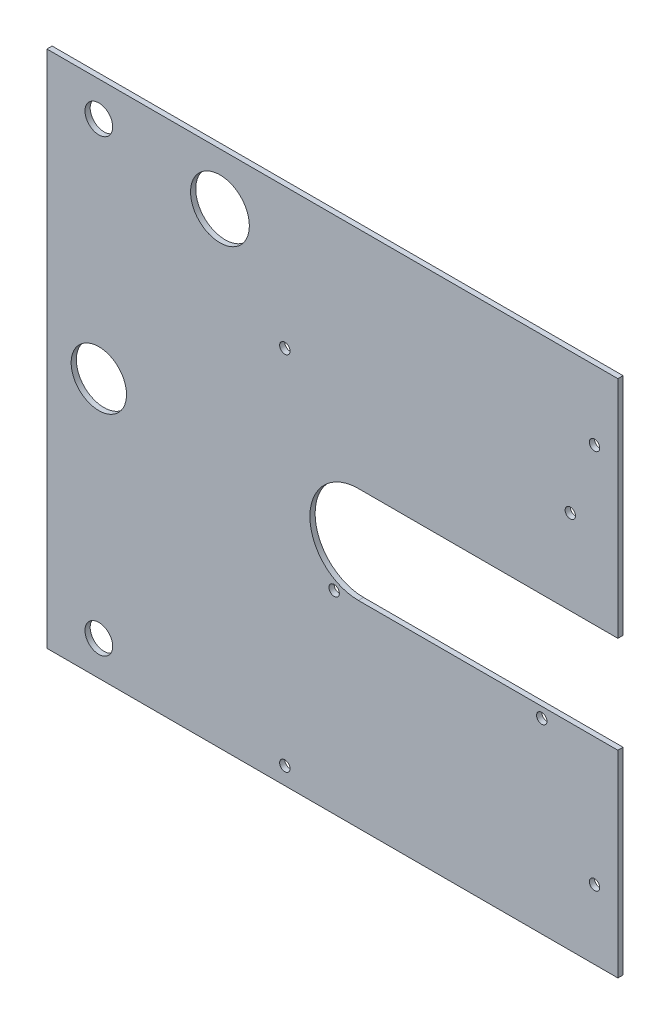
ISO-10303-21;
HEADER;
FILE_DESCRIPTION(('STEP AP214'),'2;1');
FILE_NAME('part.step','',(''),(''),'','','');
FILE_SCHEMA(('AUTOMOTIVE_DESIGN { 1 0 10303 214 1 1 1 1 }'));
ENDSEC;
DATA;
#1=APPLICATION_CONTEXT('core data for automotive mechanical design processes');
#2=APPLICATION_PROTOCOL_DEFINITION('international standard','automotive_design',2000,#1);
#3=PRODUCT_CONTEXT('',#1,'mechanical');
#4=PRODUCT('Part','Part','',(#3));
#5=PRODUCT_RELATED_PRODUCT_CATEGORY('part','',(#4));
#6=PRODUCT_DEFINITION_FORMATION('','',#4);
#7=PRODUCT_DEFINITION_CONTEXT('part definition',#1,'design');
#8=PRODUCT_DEFINITION('design','',#6,#7);
#9=PRODUCT_DEFINITION_SHAPE('','',#8);
#10=(LENGTH_UNIT() NAMED_UNIT(*) SI_UNIT(.MILLI.,.METRE.));
#11=(NAMED_UNIT(*) PLANE_ANGLE_UNIT() SI_UNIT($,.RADIAN.));
#12=(NAMED_UNIT(*) SI_UNIT($,.STERADIAN.) SOLID_ANGLE_UNIT());
#13=UNCERTAINTY_MEASURE_WITH_UNIT(LENGTH_MEASURE(1.E-05),#10,'distance_accuracy_value','');
#14=(GEOMETRIC_REPRESENTATION_CONTEXT(3) GLOBAL_UNCERTAINTY_ASSIGNED_CONTEXT((#13)) GLOBAL_UNIT_ASSIGNED_CONTEXT((#10,
#11,#12)) REPRESENTATION_CONTEXT('',''));
#15=CARTESIAN_POINT('',(0.,0.,0.));
#16=DIRECTION('',(0.,0.,1.));
#17=DIRECTION('',(1.,0.,0.));
#18=AXIS2_PLACEMENT_3D('',#15,#16,#17);
#19=CARTESIAN_POINT('',(165.,75.,1.5));
#20=DIRECTION('',(-1.,0.,0.));
#21=DIRECTION('',(0.,0.,1.));
#22=AXIS2_PLACEMENT_3D('',#19,#20,#21);
#23=PLANE('',#22);
#24=DIRECTION('',(0.,1.,0.));
#25=VECTOR('',#24,1.);
#26=CARTESIAN_POINT('',(165.,75.,1.5));
#27=LINE('',#26,#25);
#28=CARTESIAN_POINT('',(165.,9.99999999999999,1.5));
#29=VERTEX_POINT('',#28);
#30=CARTESIAN_POINT('',(165.,75.,1.5));
#31=VERTEX_POINT('',#30);
#32=EDGE_CURVE('E180',#29,#31,#27,.T.);
#33=ORIENTED_EDGE('',*,*,#32,.F.);
#34=DIRECTION('',(0.,0.,1.));
#35=VECTOR('',#34,1.);
#36=CARTESIAN_POINT('',(165.,9.99999999999999,0.));
#37=LINE('',#36,#35);
#38=CARTESIAN_POINT('',(165.,9.99999999999999,0.));
#39=VERTEX_POINT('',#38);
#40=EDGE_CURVE('E144',#39,#29,#37,.T.);
#41=ORIENTED_EDGE('',*,*,#40,.F.);
#42=DIRECTION('',(0.,1.,0.));
#43=VECTOR('',#42,1.);
#44=CARTESIAN_POINT('',(165.,75.,0.));
#45=LINE('',#44,#43);
#46=CARTESIAN_POINT('',(165.,75.,0.));
#47=VERTEX_POINT('',#46);
#48=EDGE_CURVE('E190',#39,#47,#45,.T.);
#49=ORIENTED_EDGE('',*,*,#48,.T.);
#50=DIRECTION('',(0.,0.,-1.));
#51=VECTOR('',#50,1.);
#52=CARTESIAN_POINT('',(165.,75.,1.5));
#53=LINE('',#52,#51);
#54=EDGE_CURVE('E195',#31,#47,#53,.T.);
#55=ORIENTED_EDGE('',*,*,#54,.F.);
#56=EDGE_LOOP('',(#33,#41,#49,#55));
#57=FACE_BOUND('',#56,.T.);
#58=ADVANCED_FACE('F35',(#57),#23,.F.);
#59=CARTESIAN_POINT('',(0.,75.,1.5));
#60=DIRECTION('',(1.,0.,0.));
#61=DIRECTION('',(0.,0.,-1.));
#62=AXIS2_PLACEMENT_3D('',#59,#60,#61);
#63=PLANE('',#62);
#64=DIRECTION('',(0.,-1.,0.));
#65=VECTOR('',#64,1.);
#66=CARTESIAN_POINT('',(0.,75.,0.));
#67=LINE('',#66,#65);
#68=CARTESIAN_POINT('',(0.,75.,0.));
#69=VERTEX_POINT('',#68);
#70=CARTESIAN_POINT('',(0.,-75.,0.));
#71=VERTEX_POINT('',#70);
#72=EDGE_CURVE('E174',#69,#71,#67,.T.);
#73=ORIENTED_EDGE('',*,*,#72,.T.);
#74=DIRECTION('',(0.,0.,-1.));
#75=VECTOR('',#74,1.);
#76=CARTESIAN_POINT('',(0.,-75.,1.5));
#77=LINE('',#76,#75);
#78=CARTESIAN_POINT('',(0.,-75.,1.5));
#79=VERTEX_POINT('',#78);
#80=EDGE_CURVE('E11',#79,#71,#77,.T.);
#81=ORIENTED_EDGE('',*,*,#80,.F.);
#82=DIRECTION('',(0.,-1.,0.));
#83=VECTOR('',#82,1.);
#84=CARTESIAN_POINT('',(0.,75.,1.5));
#85=LINE('',#84,#83);
#86=CARTESIAN_POINT('',(0.,75.,1.5));
#87=VERTEX_POINT('',#86);
#88=EDGE_CURVE('E177',#87,#79,#85,.T.);
#89=ORIENTED_EDGE('',*,*,#88,.F.);
#90=DIRECTION('',(0.,0.,-1.));
#91=VECTOR('',#90,1.);
#92=CARTESIAN_POINT('',(0.,75.,1.5));
#93=LINE('',#92,#91);
#94=EDGE_CURVE('E185',#87,#69,#93,.T.);
#95=ORIENTED_EDGE('',*,*,#94,.T.);
#96=EDGE_LOOP('',(#73,#81,#89,#95));
#97=FACE_BOUND('',#96,.T.);
#98=ADVANCED_FACE('F37',(#97),#63,.F.);
#99=CARTESIAN_POINT('',(0.,-75.,1.5));
#100=DIRECTION('',(0.,1.,0.));
#101=DIRECTION('',(0.,0.,1.));
#102=AXIS2_PLACEMENT_3D('',#99,#100,#101);
#103=PLANE('',#102);
#104=DIRECTION('',(1.,0.,0.));
#105=VECTOR('',#104,1.);
#106=CARTESIAN_POINT('',(0.,-75.,0.));
#107=LINE('',#106,#105);
#108=CARTESIAN_POINT('',(165.,-75.,0.));
#109=VERTEX_POINT('',#108);
#110=EDGE_CURVE('E188',#71,#109,#107,.T.);
#111=ORIENTED_EDGE('',*,*,#110,.T.);
#112=DIRECTION('',(0.,0.,-1.));
#113=VECTOR('',#112,1.);
#114=CARTESIAN_POINT('',(165.,-75.,1.5));
#115=LINE('',#114,#113);
#116=CARTESIAN_POINT('',(165.,-75.,1.5));
#117=VERTEX_POINT('',#116);
#118=EDGE_CURVE('E43',#117,#109,#115,.T.);
#119=ORIENTED_EDGE('',*,*,#118,.F.);
#120=DIRECTION('',(1.,0.,0.));
#121=VECTOR('',#120,1.);
#122=CARTESIAN_POINT('',(0.,-75.,1.5));
#123=LINE('',#122,#121);
#124=EDGE_CURVE('E87',#79,#117,#123,.T.);
#125=ORIENTED_EDGE('',*,*,#124,.F.);
#126=ORIENTED_EDGE('',*,*,#80,.T.);
#127=EDGE_LOOP('',(#111,#119,#125,#126));
#128=FACE_BOUND('',#127,.T.);
#129=ADVANCED_FACE('F202',(#128),#103,.F.);
#130=CARTESIAN_POINT('',(165.,-18.,0.));
#131=VERTEX_POINT('',#130);
#132=EDGE_CURVE('E191',#109,#131,#45,.T.);
#133=ORIENTED_EDGE('',*,*,#132,.T.);
#134=DIRECTION('',(0.,0.,1.));
#135=VECTOR('',#134,1.);
#136=CARTESIAN_POINT('',(165.,-18.,0.));
#137=LINE('',#136,#135);
#138=CARTESIAN_POINT('',(165.,-18.,1.5));
#139=VERTEX_POINT('',#138);
#140=EDGE_CURVE('E50',#131,#139,#137,.T.);
#141=ORIENTED_EDGE('',*,*,#140,.T.);
#142=EDGE_CURVE('E181',#117,#139,#27,.T.);
#143=ORIENTED_EDGE('',*,*,#142,.F.);
#144=ORIENTED_EDGE('',*,*,#118,.T.);
#145=EDGE_LOOP('',(#133,#141,#143,#144));
#146=FACE_BOUND('',#145,.T.);
#147=ADVANCED_FACE('F199',(#146),#23,.F.);
#148=CARTESIAN_POINT('',(0.,75.,1.5));
#149=DIRECTION('',(0.,-1.,0.));
#150=DIRECTION('',(0.,0.,-1.));
#151=AXIS2_PLACEMENT_3D('',#148,#149,#150);
#152=PLANE('',#151);
#153=DIRECTION('',(-1.,0.,0.));
#154=VECTOR('',#153,1.);
#155=CARTESIAN_POINT('',(0.,75.,0.));
#156=LINE('',#155,#154);
#157=EDGE_CURVE('E80',#47,#69,#156,.T.);
#158=ORIENTED_EDGE('',*,*,#157,.T.);
#159=ORIENTED_EDGE('',*,*,#94,.F.);
#160=DIRECTION('',(-1.,0.,0.));
#161=VECTOR('',#160,1.);
#162=CARTESIAN_POINT('',(0.,75.,1.5));
#163=LINE('',#162,#161);
#164=EDGE_CURVE('E59',#31,#87,#163,.T.);
#165=ORIENTED_EDGE('',*,*,#164,.F.);
#166=ORIENTED_EDGE('',*,*,#54,.T.);
#167=EDGE_LOOP('',(#158,#159,#165,#166));
#168=FACE_BOUND('',#167,.T.);
#169=ADVANCED_FACE('F205',(#168),#152,.F.);
#170=CARTESIAN_POINT('',(0.,0.,1.5));
#171=DIRECTION('',(0.,0.,1.));
#172=DIRECTION('',(1.,0.,0.));
#173=AXIS2_PLACEMENT_3D('',#170,#171,#172);
#174=PLANE('',#173);
#175=CARTESIAN_POINT('',(68.75,-70.,1.5));
#176=DIRECTION('',(0.,0.,1.));
#177=DIRECTION('',(1.,0.,0.));
#178=AXIS2_PLACEMENT_3D('',#175,#176,#177);
#179=CIRCLE('',#178,1.5);
#180=CARTESIAN_POINT('',(70.25,-70.,1.5));
#181=VERTEX_POINT('',#180);
#182=EDGE_CURVE('E418',#181,#181,#179,.T.);
#183=ORIENTED_EDGE('',*,*,#182,.F.);
#184=EDGE_LOOP('',(#183));
#185=FACE_BOUND('',#184,.T.);
#186=CARTESIAN_POINT('',(68.75,34.5,1.5));
#187=DIRECTION('',(0.,0.,1.));
#188=DIRECTION('',(1.,0.,0.));
#189=AXIS2_PLACEMENT_3D('',#186,#187,#188);
#190=CIRCLE('',#189,1.5);
#191=CARTESIAN_POINT('',(70.25,34.5,1.5));
#192=VERTEX_POINT('',#191);
#193=EDGE_CURVE('E420',#192,#192,#190,.T.);
#194=ORIENTED_EDGE('',*,*,#193,.F.);
#195=EDGE_LOOP('',(#194));
#196=FACE_BOUND('',#195,.T.);
#197=CARTESIAN_POINT('',(50.,60.,1.5));
#198=DIRECTION('',(0.,0.,1.));
#199=DIRECTION('',(1.,0.,0.));
#200=AXIS2_PLACEMENT_3D('',#197,#198,#199);
#201=CIRCLE('',#200,8.50000000000001);
#202=CARTESIAN_POINT('',(58.5,60.,1.5));
#203=VERTEX_POINT('',#202);
#204=EDGE_CURVE('E426',#203,#203,#201,.T.);
#205=ORIENTED_EDGE('',*,*,#204,.F.);
#206=EDGE_LOOP('',(#205));
#207=FACE_BOUND('',#206,.T.);
#208=CARTESIAN_POINT('',(14.9999999999998,-65.,1.5));
#209=DIRECTION('',(0.,0.,1.));
#210=DIRECTION('',(1.,0.,0.));
#211=AXIS2_PLACEMENT_3D('',#208,#209,#210);
#212=CIRCLE('',#211,4.00000000000001);
#213=CARTESIAN_POINT('',(18.9999999999998,-65.,1.5));
#214=VERTEX_POINT('',#213);
#215=EDGE_CURVE('E432',#214,#214,#212,.T.);
#216=ORIENTED_EDGE('',*,*,#215,.F.);
#217=EDGE_LOOP('',(#216));
#218=FACE_BOUND('',#217,.T.);
#219=CARTESIAN_POINT('',(14.9999999999998,65.,1.5));
#220=DIRECTION('',(0.,0.,1.));
#221=DIRECTION('',(1.,0.,0.));
#222=AXIS2_PLACEMENT_3D('',#219,#220,#221);
#223=CIRCLE('',#222,4.00000000000001);
#224=CARTESIAN_POINT('',(18.9999999999998,65.,1.5));
#225=VERTEX_POINT('',#224);
#226=EDGE_CURVE('E438',#225,#225,#223,.T.);
#227=ORIENTED_EDGE('',*,*,#226,.F.);
#228=EDGE_LOOP('',(#227));
#229=FACE_BOUND('',#228,.T.);
#230=CARTESIAN_POINT('',(15.,0.,1.5));
#231=DIRECTION('',(0.,0.,1.));
#232=DIRECTION('',(1.,0.,0.));
#233=AXIS2_PLACEMENT_3D('',#230,#231,#232);
#234=CIRCLE('',#233,8.00000000000001);
#235=CARTESIAN_POINT('',(23.,0.,1.5));
#236=VERTEX_POINT('',#235);
#237=EDGE_CURVE('E134',#236,#236,#234,.T.);
#238=ORIENTED_EDGE('',*,*,#237,.F.);
#239=EDGE_LOOP('',(#238));
#240=FACE_BOUND('',#239,.T.);
#241=DIRECTION('',(-1.,0.,0.));
#242=VECTOR('',#241,1.);
#243=CARTESIAN_POINT('',(90.,9.99999999999998,1.5));
#244=LINE('',#243,#242);
#245=CARTESIAN_POINT('',(90.,9.99999999999998,1.5));
#246=VERTEX_POINT('',#245);
#247=EDGE_CURVE('E128',#29,#246,#244,.T.);
#248=ORIENTED_EDGE('',*,*,#247,.F.);
#249=ORIENTED_EDGE('',*,*,#32,.T.);
#250=ORIENTED_EDGE('',*,*,#164,.T.);
#251=ORIENTED_EDGE('',*,*,#88,.T.);
#252=ORIENTED_EDGE('',*,*,#124,.T.);
#253=ORIENTED_EDGE('',*,*,#142,.T.);
#254=DIRECTION('',(1.,0.,0.));
#255=VECTOR('',#254,1.);
#256=CARTESIAN_POINT('',(165.,-18.,1.5));
#257=LINE('',#256,#255);
#258=CARTESIAN_POINT('',(90.,-18.,1.5));
#259=VERTEX_POINT('',#258);
#260=EDGE_CURVE('E131',#259,#139,#257,.T.);
#261=ORIENTED_EDGE('',*,*,#260,.F.);
#262=CARTESIAN_POINT('',(90.,-4.00000000000001,1.5));
#263=DIRECTION('',(0.,0.,1.));
#264=DIRECTION('',(-1.,0.,0.));
#265=AXIS2_PLACEMENT_3D('',#262,#263,#264);
#266=CIRCLE('',#265,14.);
#267=EDGE_CURVE('E116',#246,#259,#266,.T.);
#268=ORIENTED_EDGE('',*,*,#267,.F.);
#269=EDGE_LOOP('',(#248,#249,#250,#251,#252,#253,#261,#268));
#270=FACE_BOUND('',#269,.T.);
#271=CARTESIAN_POINT('',(143.,-21.,1.5));
#272=DIRECTION('',(0.,0.,1.));
#273=DIRECTION('',(1.,0.,0.));
#274=AXIS2_PLACEMENT_3D('',#271,#272,#273);
#275=CIRCLE('',#274,1.49999999999997);
#276=CARTESIAN_POINT('',(144.5,-21.,1.5));
#277=VERTEX_POINT('',#276);
#278=EDGE_CURVE('E143',#277,#277,#275,.T.);
#279=ORIENTED_EDGE('',*,*,#278,.F.);
#280=EDGE_LOOP('',(#279));
#281=FACE_BOUND('',#280,.T.);
#282=CARTESIAN_POINT('',(83.,-19.,1.5));
#283=DIRECTION('',(0.,0.,1.));
#284=DIRECTION('',(1.,0.,0.));
#285=AXIS2_PLACEMENT_3D('',#282,#283,#284);
#286=CIRCLE('',#285,1.5);
#287=CARTESIAN_POINT('',(84.5,-19.,1.5));
#288=VERTEX_POINT('',#287);
#289=EDGE_CURVE('E150',#288,#288,#286,.T.);
#290=ORIENTED_EDGE('',*,*,#289,.F.);
#291=EDGE_LOOP('',(#290));
#292=FACE_BOUND('',#291,.T.);
#293=CARTESIAN_POINT('',(151.25,34.5,1.5));
#294=DIRECTION('',(0.,0.,1.));
#295=DIRECTION('',(1.,0.,0.));
#296=AXIS2_PLACEMENT_3D('',#293,#294,#295);
#297=CIRCLE('',#296,1.5);
#298=CARTESIAN_POINT('',(152.75,34.5,1.5));
#299=VERTEX_POINT('',#298);
#300=EDGE_CURVE('E156',#299,#299,#297,.T.);
#301=ORIENTED_EDGE('',*,*,#300,.F.);
#302=EDGE_LOOP('',(#301));
#303=FACE_BOUND('',#302,.T.);
#304=CARTESIAN_POINT('',(158.25,-55.,1.5));
#305=DIRECTION('',(0.,0.,1.));
#306=DIRECTION('',(1.,0.,0.));
#307=AXIS2_PLACEMENT_3D('',#304,#305,#306);
#308=CIRCLE('',#307,1.5);
#309=CARTESIAN_POINT('',(159.75,-55.,1.5));
#310=VERTEX_POINT('',#309);
#311=EDGE_CURVE('E162',#310,#310,#308,.T.);
#312=ORIENTED_EDGE('',*,*,#311,.F.);
#313=EDGE_LOOP('',(#312));
#314=FACE_BOUND('',#313,.T.);
#315=CARTESIAN_POINT('',(158.25,55.,1.5));
#316=DIRECTION('',(0.,0.,1.));
#317=DIRECTION('',(1.,0.,0.));
#318=AXIS2_PLACEMENT_3D('',#315,#316,#317);
#319=CIRCLE('',#318,1.5);
#320=CARTESIAN_POINT('',(159.75,55.,1.5));
#321=VERTEX_POINT('',#320);
#322=EDGE_CURVE('E168',#321,#321,#319,.T.);
#323=ORIENTED_EDGE('',*,*,#322,.F.);
#324=EDGE_LOOP('',(#323));
#325=FACE_BOUND('',#324,.T.);
#326=ADVANCED_FACE('F213',(#185,#196,#207,#218,#229,#240,#270,#281,#292,#303,#314,#325),#174,.T.);
#327=CARTESIAN_POINT('',(0.,0.,0.));
#328=DIRECTION('',(0.,0.,1.));
#329=DIRECTION('',(1.,0.,0.));
#330=AXIS2_PLACEMENT_3D('',#327,#328,#329);
#331=PLANE('',#330);
#332=CARTESIAN_POINT('',(68.75,-70.,0.));
#333=DIRECTION('',(0.,0.,1.));
#334=DIRECTION('',(1.,0.,0.));
#335=AXIS2_PLACEMENT_3D('',#332,#333,#334);
#336=CIRCLE('',#335,1.5);
#337=CARTESIAN_POINT('',(70.25,-70.,0.));
#338=VERTEX_POINT('',#337);
#339=EDGE_CURVE('E415',#338,#338,#336,.T.);
#340=ORIENTED_EDGE('',*,*,#339,.T.);
#341=EDGE_LOOP('',(#340));
#342=FACE_BOUND('',#341,.T.);
#343=CARTESIAN_POINT('',(68.75,34.5,0.));
#344=DIRECTION('',(0.,0.,1.));
#345=DIRECTION('',(1.,0.,0.));
#346=AXIS2_PLACEMENT_3D('',#343,#344,#345);
#347=CIRCLE('',#346,1.5);
#348=CARTESIAN_POINT('',(70.25,34.5,0.));
#349=VERTEX_POINT('',#348);
#350=EDGE_CURVE('E423',#349,#349,#347,.T.);
#351=ORIENTED_EDGE('',*,*,#350,.T.);
#352=EDGE_LOOP('',(#351));
#353=FACE_BOUND('',#352,.T.);
#354=CARTESIAN_POINT('',(50.,60.,0.));
#355=DIRECTION('',(0.,0.,1.));
#356=DIRECTION('',(1.,0.,0.));
#357=AXIS2_PLACEMENT_3D('',#354,#355,#356);
#358=CIRCLE('',#357,8.50000000000001);
#359=CARTESIAN_POINT('',(58.5,60.,0.));
#360=VERTEX_POINT('',#359);
#361=EDGE_CURVE('E429',#360,#360,#358,.T.);
#362=ORIENTED_EDGE('',*,*,#361,.T.);
#363=EDGE_LOOP('',(#362));
#364=FACE_BOUND('',#363,.T.);
#365=CARTESIAN_POINT('',(14.9999999999998,-65.,0.));
#366=DIRECTION('',(0.,0.,1.));
#367=DIRECTION('',(1.,0.,0.));
#368=AXIS2_PLACEMENT_3D('',#365,#366,#367);
#369=CIRCLE('',#368,4.00000000000001);
#370=CARTESIAN_POINT('',(18.9999999999998,-65.,0.));
#371=VERTEX_POINT('',#370);
#372=EDGE_CURVE('E435',#371,#371,#369,.T.);
#373=ORIENTED_EDGE('',*,*,#372,.T.);
#374=EDGE_LOOP('',(#373));
#375=FACE_BOUND('',#374,.T.);
#376=CARTESIAN_POINT('',(14.9999999999998,65.,0.));
#377=DIRECTION('',(0.,0.,1.));
#378=DIRECTION('',(1.,0.,0.));
#379=AXIS2_PLACEMENT_3D('',#376,#377,#378);
#380=CIRCLE('',#379,4.00000000000001);
#381=CARTESIAN_POINT('',(18.9999999999998,65.,0.));
#382=VERTEX_POINT('',#381);
#383=EDGE_CURVE('E441',#382,#382,#380,.T.);
#384=ORIENTED_EDGE('',*,*,#383,.T.);
#385=EDGE_LOOP('',(#384));
#386=FACE_BOUND('',#385,.T.);
#387=CARTESIAN_POINT('',(15.,0.,0.));
#388=DIRECTION('',(0.,0.,1.));
#389=DIRECTION('',(1.,0.,0.));
#390=AXIS2_PLACEMENT_3D('',#387,#388,#389);
#391=CIRCLE('',#390,8.00000000000001);
#392=CARTESIAN_POINT('',(23.,0.,0.));
#393=VERTEX_POINT('',#392);
#394=EDGE_CURVE('E139',#393,#393,#391,.T.);
#395=ORIENTED_EDGE('',*,*,#394,.T.);
#396=EDGE_LOOP('',(#395));
#397=FACE_BOUND('',#396,.T.);
#398=CARTESIAN_POINT('',(143.,-21.,0.));
#399=DIRECTION('',(0.,0.,1.));
#400=DIRECTION('',(1.,0.,0.));
#401=AXIS2_PLACEMENT_3D('',#398,#399,#400);
#402=CIRCLE('',#401,1.49999999999997);
#403=CARTESIAN_POINT('',(144.5,-21.,0.));
#404=VERTEX_POINT('',#403);
#405=EDGE_CURVE('E147',#404,#404,#402,.T.);
#406=ORIENTED_EDGE('',*,*,#405,.T.);
#407=EDGE_LOOP('',(#406));
#408=FACE_BOUND('',#407,.T.);
#409=CARTESIAN_POINT('',(83.,-19.,0.));
#410=DIRECTION('',(0.,0.,1.));
#411=DIRECTION('',(1.,0.,0.));
#412=AXIS2_PLACEMENT_3D('',#409,#410,#411);
#413=CIRCLE('',#412,1.5);
#414=CARTESIAN_POINT('',(84.5,-19.,0.));
#415=VERTEX_POINT('',#414);
#416=EDGE_CURVE('E153',#415,#415,#413,.T.);
#417=ORIENTED_EDGE('',*,*,#416,.T.);
#418=EDGE_LOOP('',(#417));
#419=FACE_BOUND('',#418,.T.);
#420=CARTESIAN_POINT('',(151.25,34.5,0.));
#421=DIRECTION('',(0.,0.,1.));
#422=DIRECTION('',(1.,0.,0.));
#423=AXIS2_PLACEMENT_3D('',#420,#421,#422);
#424=CIRCLE('',#423,1.5);
#425=CARTESIAN_POINT('',(152.75,34.5,0.));
#426=VERTEX_POINT('',#425);
#427=EDGE_CURVE('E159',#426,#426,#424,.T.);
#428=ORIENTED_EDGE('',*,*,#427,.T.);
#429=EDGE_LOOP('',(#428));
#430=FACE_BOUND('',#429,.T.);
#431=CARTESIAN_POINT('',(158.25,-55.,0.));
#432=DIRECTION('',(0.,0.,1.));
#433=DIRECTION('',(1.,0.,0.));
#434=AXIS2_PLACEMENT_3D('',#431,#432,#433);
#435=CIRCLE('',#434,1.5);
#436=CARTESIAN_POINT('',(159.75,-55.,0.));
#437=VERTEX_POINT('',#436);
#438=EDGE_CURVE('E165',#437,#437,#435,.T.);
#439=ORIENTED_EDGE('',*,*,#438,.T.);
#440=EDGE_LOOP('',(#439));
#441=FACE_BOUND('',#440,.T.);
#442=CARTESIAN_POINT('',(158.25,55.,0.));
#443=DIRECTION('',(0.,0.,1.));
#444=DIRECTION('',(1.,0.,0.));
#445=AXIS2_PLACEMENT_3D('',#442,#443,#444);
#446=CIRCLE('',#445,1.5);
#447=CARTESIAN_POINT('',(159.75,55.,0.));
#448=VERTEX_POINT('',#447);
#449=EDGE_CURVE('E171',#448,#448,#446,.T.);
#450=ORIENTED_EDGE('',*,*,#449,.T.);
#451=EDGE_LOOP('',(#450));
#452=FACE_BOUND('',#451,.T.);
#453=ORIENTED_EDGE('',*,*,#48,.F.);
#454=DIRECTION('',(-1.,0.,0.));
#455=VECTOR('',#454,1.);
#456=CARTESIAN_POINT('',(90.,9.99999999999998,0.));
#457=LINE('',#456,#455);
#458=CARTESIAN_POINT('',(90.,9.99999999999998,0.));
#459=VERTEX_POINT('',#458);
#460=EDGE_CURVE('E118',#39,#459,#457,.T.);
#461=ORIENTED_EDGE('',*,*,#460,.T.);
#462=CARTESIAN_POINT('',(90.,-4.00000000000001,0.));
#463=DIRECTION('',(0.,0.,1.));
#464=DIRECTION('',(-1.,0.,0.));
#465=AXIS2_PLACEMENT_3D('',#462,#463,#464);
#466=CIRCLE('',#465,14.);
#467=CARTESIAN_POINT('',(90.,-18.,0.));
#468=VERTEX_POINT('',#467);
#469=EDGE_CURVE('E113',#459,#468,#466,.T.);
#470=ORIENTED_EDGE('',*,*,#469,.T.);
#471=DIRECTION('',(1.,0.,0.));
#472=VECTOR('',#471,1.);
#473=CARTESIAN_POINT('',(165.,-18.,0.));
#474=LINE('',#473,#472);
#475=EDGE_CURVE('E120',#468,#131,#474,.T.);
#476=ORIENTED_EDGE('',*,*,#475,.T.);
#477=ORIENTED_EDGE('',*,*,#132,.F.);
#478=ORIENTED_EDGE('',*,*,#110,.F.);
#479=ORIENTED_EDGE('',*,*,#72,.F.);
#480=ORIENTED_EDGE('',*,*,#157,.F.);
#481=EDGE_LOOP('',(#453,#461,#470,#476,#477,#478,#479,#480));
#482=FACE_BOUND('',#481,.T.);
#483=ADVANCED_FACE('F127',(#342,#353,#364,#375,#386,#397,#408,#419,#430,#441,#452,#482),#331,.F.);
#484=CARTESIAN_POINT('',(158.25,55.,0.));
#485=DIRECTION('',(0.,0.,1.));
#486=DIRECTION('',(1.,0.,0.));
#487=AXIS2_PLACEMENT_3D('',#484,#485,#486);
#488=CYLINDRICAL_SURFACE('',#487,1.5);
#489=ORIENTED_EDGE('',*,*,#449,.F.);
#490=EDGE_LOOP('',(#489));
#491=FACE_BOUND('',#490,.T.);
#492=ORIENTED_EDGE('',*,*,#322,.T.);
#493=EDGE_LOOP('',(#492));
#494=FACE_BOUND('',#493,.T.);
#495=ADVANCED_FACE('F228',(#491,#494),#488,.F.);
#496=CARTESIAN_POINT('',(158.25,-55.,0.));
#497=DIRECTION('',(0.,0.,1.));
#498=DIRECTION('',(1.,0.,0.));
#499=AXIS2_PLACEMENT_3D('',#496,#497,#498);
#500=CYLINDRICAL_SURFACE('',#499,1.5);
#501=ORIENTED_EDGE('',*,*,#438,.F.);
#502=EDGE_LOOP('',(#501));
#503=FACE_BOUND('',#502,.T.);
#504=ORIENTED_EDGE('',*,*,#311,.T.);
#505=EDGE_LOOP('',(#504));
#506=FACE_BOUND('',#505,.T.);
#507=ADVANCED_FACE('F230',(#503,#506),#500,.F.);
#508=CARTESIAN_POINT('',(151.25,34.5,0.));
#509=DIRECTION('',(0.,0.,1.));
#510=DIRECTION('',(1.,0.,0.));
#511=AXIS2_PLACEMENT_3D('',#508,#509,#510);
#512=CYLINDRICAL_SURFACE('',#511,1.5);
#513=ORIENTED_EDGE('',*,*,#427,.F.);
#514=EDGE_LOOP('',(#513));
#515=FACE_BOUND('',#514,.T.);
#516=ORIENTED_EDGE('',*,*,#300,.T.);
#517=EDGE_LOOP('',(#516));
#518=FACE_BOUND('',#517,.T.);
#519=ADVANCED_FACE('F237',(#515,#518),#512,.F.);
#520=CARTESIAN_POINT('',(83.,-19.,0.));
#521=DIRECTION('',(0.,0.,1.));
#522=DIRECTION('',(1.,0.,0.));
#523=AXIS2_PLACEMENT_3D('',#520,#521,#522);
#524=CYLINDRICAL_SURFACE('',#523,1.5);
#525=ORIENTED_EDGE('',*,*,#416,.F.);
#526=EDGE_LOOP('',(#525));
#527=FACE_BOUND('',#526,.T.);
#528=ORIENTED_EDGE('',*,*,#289,.T.);
#529=EDGE_LOOP('',(#528));
#530=FACE_BOUND('',#529,.T.);
#531=ADVANCED_FACE('F304',(#527,#530),#524,.F.);
#532=CARTESIAN_POINT('',(143.,-21.,0.));
#533=DIRECTION('',(0.,0.,1.));
#534=DIRECTION('',(1.,0.,0.));
#535=AXIS2_PLACEMENT_3D('',#532,#533,#534);
#536=CYLINDRICAL_SURFACE('',#535,1.49999999999997);
#537=ORIENTED_EDGE('',*,*,#405,.F.);
#538=EDGE_LOOP('',(#537));
#539=FACE_BOUND('',#538,.T.);
#540=ORIENTED_EDGE('',*,*,#278,.T.);
#541=EDGE_LOOP('',(#540));
#542=FACE_BOUND('',#541,.T.);
#543=ADVANCED_FACE('F313',(#539,#542),#536,.F.);
#544=CARTESIAN_POINT('',(90.,-4.00000000000001,0.));
#545=DIRECTION('',(0.,0.,1.));
#546=DIRECTION('',(1.,0.,0.));
#547=AXIS2_PLACEMENT_3D('',#544,#545,#546);
#548=CYLINDRICAL_SURFACE('',#547,14.);
#549=ORIENTED_EDGE('',*,*,#267,.T.);
#550=DIRECTION('',(0.,0.,1.));
#551=VECTOR('',#550,1.);
#552=CARTESIAN_POINT('',(90.,-18.,0.));
#553=LINE('',#552,#551);
#554=EDGE_CURVE('E110',#468,#259,#553,.T.);
#555=ORIENTED_EDGE('',*,*,#554,.F.);
#556=ORIENTED_EDGE('',*,*,#469,.F.);
#557=DIRECTION('',(0.,0.,1.));
#558=VECTOR('',#557,1.);
#559=CARTESIAN_POINT('',(90.,9.99999999999998,0.));
#560=LINE('',#559,#558);
#561=EDGE_CURVE('E141',#459,#246,#560,.T.);
#562=ORIENTED_EDGE('',*,*,#561,.T.);
#563=EDGE_LOOP('',(#549,#555,#556,#562));
#564=FACE_BOUND('',#563,.T.);
#565=ADVANCED_FACE('F111',(#564),#548,.F.);
#566=CARTESIAN_POINT('',(90.,9.99999999999998,0.));
#567=DIRECTION('',(0.,1.,0.));
#568=DIRECTION('',(-1.,0.,0.));
#569=AXIS2_PLACEMENT_3D('',#566,#567,#568);
#570=PLANE('',#569);
#571=ORIENTED_EDGE('',*,*,#247,.T.);
#572=ORIENTED_EDGE('',*,*,#561,.F.);
#573=ORIENTED_EDGE('',*,*,#460,.F.);
#574=ORIENTED_EDGE('',*,*,#40,.T.);
#575=EDGE_LOOP('',(#571,#572,#573,#574));
#576=FACE_BOUND('',#575,.T.);
#577=ADVANCED_FACE('F212',(#576),#570,.F.);
#578=CARTESIAN_POINT('',(165.,-18.,0.));
#579=DIRECTION('',(0.,-1.,0.));
#580=DIRECTION('',(1.,0.,0.));
#581=AXIS2_PLACEMENT_3D('',#578,#579,#580);
#582=PLANE('',#581);
#583=ORIENTED_EDGE('',*,*,#260,.T.);
#584=ORIENTED_EDGE('',*,*,#140,.F.);
#585=ORIENTED_EDGE('',*,*,#475,.F.);
#586=ORIENTED_EDGE('',*,*,#554,.T.);
#587=EDGE_LOOP('',(#583,#584,#585,#586));
#588=FACE_BOUND('',#587,.T.);
#589=ADVANCED_FACE('F121',(#588),#582,.F.);
#590=CARTESIAN_POINT('',(15.,0.,0.));
#591=DIRECTION('',(0.,0.,1.));
#592=DIRECTION('',(1.,0.,0.));
#593=AXIS2_PLACEMENT_3D('',#590,#591,#592);
#594=CYLINDRICAL_SURFACE('',#593,8.00000000000001);
#595=ORIENTED_EDGE('',*,*,#394,.F.);
#596=EDGE_LOOP('',(#595));
#597=FACE_BOUND('',#596,.T.);
#598=ORIENTED_EDGE('',*,*,#237,.T.);
#599=EDGE_LOOP('',(#598));
#600=FACE_BOUND('',#599,.T.);
#601=ADVANCED_FACE('F344',(#597,#600),#594,.F.);
#602=CARTESIAN_POINT('',(14.9999999999998,65.,0.));
#603=DIRECTION('',(0.,0.,1.));
#604=DIRECTION('',(1.,0.,0.));
#605=AXIS2_PLACEMENT_3D('',#602,#603,#604);
#606=CYLINDRICAL_SURFACE('',#605,4.00000000000001);
#607=ORIENTED_EDGE('',*,*,#383,.F.);
#608=EDGE_LOOP('',(#607));
#609=FACE_BOUND('',#608,.T.);
#610=ORIENTED_EDGE('',*,*,#226,.T.);
#611=EDGE_LOOP('',(#610));
#612=FACE_BOUND('',#611,.T.);
#613=ADVANCED_FACE('F352',(#609,#612),#606,.F.);
#614=CARTESIAN_POINT('',(14.9999999999998,-65.,0.));
#615=DIRECTION('',(0.,0.,1.));
#616=DIRECTION('',(1.,0.,0.));
#617=AXIS2_PLACEMENT_3D('',#614,#615,#616);
#618=CYLINDRICAL_SURFACE('',#617,4.00000000000001);
#619=ORIENTED_EDGE('',*,*,#372,.F.);
#620=EDGE_LOOP('',(#619));
#621=FACE_BOUND('',#620,.T.);
#622=ORIENTED_EDGE('',*,*,#215,.T.);
#623=EDGE_LOOP('',(#622));
#624=FACE_BOUND('',#623,.T.);
#625=ADVANCED_FACE('F361',(#621,#624),#618,.F.);
#626=CARTESIAN_POINT('',(50.,60.,0.));
#627=DIRECTION('',(0.,0.,1.));
#628=DIRECTION('',(1.,0.,0.));
#629=AXIS2_PLACEMENT_3D('',#626,#627,#628);
#630=CYLINDRICAL_SURFACE('',#629,8.50000000000001);
#631=ORIENTED_EDGE('',*,*,#361,.F.);
#632=EDGE_LOOP('',(#631));
#633=FACE_BOUND('',#632,.T.);
#634=ORIENTED_EDGE('',*,*,#204,.T.);
#635=EDGE_LOOP('',(#634));
#636=FACE_BOUND('',#635,.T.);
#637=ADVANCED_FACE('F370',(#633,#636),#630,.F.);
#638=CARTESIAN_POINT('',(68.75,34.5,0.));
#639=DIRECTION('',(0.,0.,1.));
#640=DIRECTION('',(1.,0.,0.));
#641=AXIS2_PLACEMENT_3D('',#638,#639,#640);
#642=CYLINDRICAL_SURFACE('',#641,1.5);
#643=ORIENTED_EDGE('',*,*,#350,.F.);
#644=EDGE_LOOP('',(#643));
#645=FACE_BOUND('',#644,.T.);
#646=ORIENTED_EDGE('',*,*,#193,.T.);
#647=EDGE_LOOP('',(#646));
#648=FACE_BOUND('',#647,.T.);
#649=ADVANCED_FACE('F379',(#645,#648),#642,.F.);
#650=CARTESIAN_POINT('',(68.75,-70.,0.));
#651=DIRECTION('',(0.,0.,1.));
#652=DIRECTION('',(1.,0.,0.));
#653=AXIS2_PLACEMENT_3D('',#650,#651,#652);
#654=CYLINDRICAL_SURFACE('',#653,1.5);
#655=ORIENTED_EDGE('',*,*,#339,.F.);
#656=EDGE_LOOP('',(#655));
#657=FACE_BOUND('',#656,.T.);
#658=ORIENTED_EDGE('',*,*,#182,.T.);
#659=EDGE_LOOP('',(#658));
#660=FACE_BOUND('',#659,.T.);
#661=ADVANCED_FACE('F388',(#657,#660),#654,.F.);
#662=CLOSED_SHELL('',(#58,#98,#129,#147,#169,#326,#483,#495,#507,#519,#531,#543,#565,#577,#589,
#601,#613,#625,#637,#649,#661));
#663=MANIFOLD_SOLID_BREP('B2',#662);
#664=ADVANCED_BREP_SHAPE_REPRESENTATION('',(#18,#663),#14);
#665=SHAPE_DEFINITION_REPRESENTATION(#9,#664);
ENDSEC;
END-ISO-10303-21;
